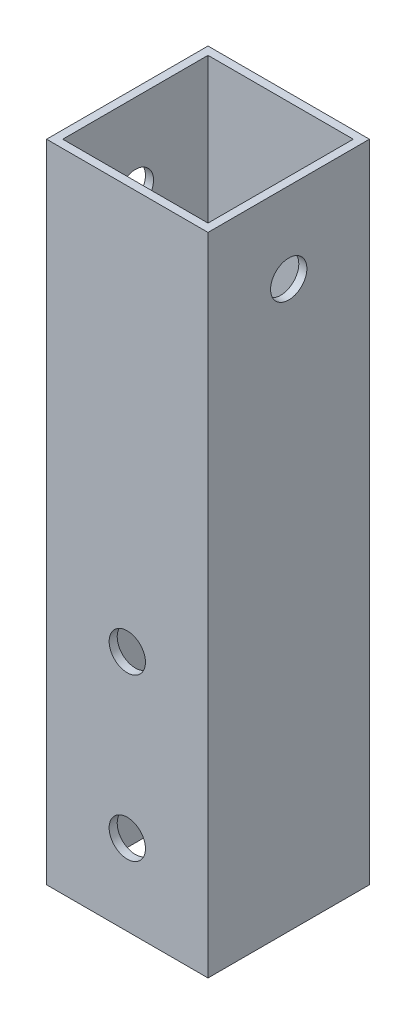
ISO-10303-21;
HEADER;
FILE_DESCRIPTION(('STEP AP214'),'2;1');
FILE_NAME('part.step','',(''),(''),'','','');
FILE_SCHEMA(('AUTOMOTIVE_DESIGN { 1 0 10303 214 1 1 1 1 }'));
ENDSEC;
DATA;
#1=APPLICATION_CONTEXT('core data for automotive mechanical design processes');
#2=APPLICATION_PROTOCOL_DEFINITION('international standard','automotive_design',2000,#1);
#3=PRODUCT_CONTEXT('',#1,'mechanical');
#4=PRODUCT('Part','Part','',(#3));
#5=PRODUCT_RELATED_PRODUCT_CATEGORY('part','',(#4));
#6=PRODUCT_DEFINITION_FORMATION('','',#4);
#7=PRODUCT_DEFINITION_CONTEXT('part definition',#1,'design');
#8=PRODUCT_DEFINITION('design','',#6,#7);
#9=PRODUCT_DEFINITION_SHAPE('','',#8);
#10=(LENGTH_UNIT() NAMED_UNIT(*) SI_UNIT(.MILLI.,.METRE.));
#11=(NAMED_UNIT(*) PLANE_ANGLE_UNIT() SI_UNIT($,.RADIAN.));
#12=(NAMED_UNIT(*) SI_UNIT($,.STERADIAN.) SOLID_ANGLE_UNIT());
#13=UNCERTAINTY_MEASURE_WITH_UNIT(LENGTH_MEASURE(1.E-05),#10,'distance_accuracy_value','');
#14=(GEOMETRIC_REPRESENTATION_CONTEXT(3) GLOBAL_UNCERTAINTY_ASSIGNED_CONTEXT((#13)) GLOBAL_UNIT_ASSIGNED_CONTEXT((#10,
#11,#12)) REPRESENTATION_CONTEXT('',''));
#15=CARTESIAN_POINT('',(0.,0.,0.));
#16=DIRECTION('',(0.,0.,1.));
#17=DIRECTION('',(1.,0.,0.));
#18=AXIS2_PLACEMENT_3D('',#15,#16,#17);
#19=CARTESIAN_POINT('',(0.,80.,0.));
#20=DIRECTION('',(0.,-1.,0.));
#21=DIRECTION('',(0.,0.,-1.));
#22=AXIS2_PLACEMENT_3D('',#19,#20,#21);
#23=PLANE('',#22);
#24=DIRECTION('',(0.,0.,-1.));
#25=VECTOR('',#24,1.);
#26=CARTESIAN_POINT('',(10.,80.,10.));
#27=LINE('',#26,#25);
#28=CARTESIAN_POINT('',(10.,80.,10.));
#29=VERTEX_POINT('',#28);
#30=CARTESIAN_POINT('',(10.,80.,-10.));
#31=VERTEX_POINT('',#30);
#32=EDGE_CURVE('E142',#29,#31,#27,.T.);
#33=ORIENTED_EDGE('',*,*,#32,.T.);
#34=DIRECTION('',(-1.,0.,0.));
#35=VECTOR('',#34,1.);
#36=CARTESIAN_POINT('',(-10.,80.,-10.));
#37=LINE('',#36,#35);
#38=CARTESIAN_POINT('',(-10.,80.,-10.));
#39=VERTEX_POINT('',#38);
#40=EDGE_CURVE('E145',#31,#39,#37,.T.);
#41=ORIENTED_EDGE('',*,*,#40,.T.);
#42=DIRECTION('',(0.,0.,1.));
#43=VECTOR('',#42,1.);
#44=CARTESIAN_POINT('',(-10.,80.,10.));
#45=LINE('',#44,#43);
#46=CARTESIAN_POINT('',(-10.,80.,10.));
#47=VERTEX_POINT('',#46);
#48=EDGE_CURVE('E148',#39,#47,#45,.T.);
#49=ORIENTED_EDGE('',*,*,#48,.T.);
#50=DIRECTION('',(1.,0.,0.));
#51=VECTOR('',#50,1.);
#52=CARTESIAN_POINT('',(-10.,80.,10.));
#53=LINE('',#52,#51);
#54=EDGE_CURVE('E150',#47,#29,#53,.T.);
#55=ORIENTED_EDGE('',*,*,#54,.T.);
#56=EDGE_LOOP('',(#33,#41,#49,#55));
#57=FACE_BOUND('',#56,.T.);
#58=DIRECTION('',(1.,0.,0.));
#59=VECTOR('',#58,1.);
#60=CARTESIAN_POINT('',(-9.,80.,9.));
#61=LINE('',#60,#59);
#62=CARTESIAN_POINT('',(-9.,80.,9.));
#63=VERTEX_POINT('',#62);
#64=CARTESIAN_POINT('',(9.,80.,9.));
#65=VERTEX_POINT('',#64);
#66=EDGE_CURVE('E104',#63,#65,#61,.T.);
#67=ORIENTED_EDGE('',*,*,#66,.F.);
#68=DIRECTION('',(0.,0.,1.));
#69=VECTOR('',#68,1.);
#70=CARTESIAN_POINT('',(-9.,80.,9.));
#71=LINE('',#70,#69);
#72=CARTESIAN_POINT('',(-9.,80.,-9.));
#73=VERTEX_POINT('',#72);
#74=EDGE_CURVE('E126',#73,#63,#71,.T.);
#75=ORIENTED_EDGE('',*,*,#74,.F.);
#76=DIRECTION('',(-1.,0.,0.));
#77=VECTOR('',#76,1.);
#78=CARTESIAN_POINT('',(-9.,80.,-9.));
#79=LINE('',#78,#77);
#80=CARTESIAN_POINT('',(9.,80.,-9.));
#81=VERTEX_POINT('',#80);
#82=EDGE_CURVE('E124',#81,#73,#79,.T.);
#83=ORIENTED_EDGE('',*,*,#82,.F.);
#84=DIRECTION('',(0.,0.,-1.));
#85=VECTOR('',#84,1.);
#86=CARTESIAN_POINT('',(9.,80.,9.));
#87=LINE('',#86,#85);
#88=EDGE_CURVE('E112',#65,#81,#87,.T.);
#89=ORIENTED_EDGE('',*,*,#88,.F.);
#90=EDGE_LOOP('',(#67,#75,#83,#89));
#91=FACE_BOUND('',#90,.T.);
#92=ADVANCED_FACE('F37',(#57,#91),#23,.F.);
#93=CARTESIAN_POINT('',(0.,0.,0.));
#94=DIRECTION('',(0.,-1.,0.));
#95=DIRECTION('',(0.,0.,-1.));
#96=AXIS2_PLACEMENT_3D('',#93,#94,#95);
#97=PLANE('',#96);
#98=DIRECTION('',(0.,0.,-1.));
#99=VECTOR('',#98,1.);
#100=CARTESIAN_POINT('',(10.,0.,10.));
#101=LINE('',#100,#99);
#102=CARTESIAN_POINT('',(10.,0.,10.));
#103=VERTEX_POINT('',#102);
#104=CARTESIAN_POINT('',(10.,0.,-10.));
#105=VERTEX_POINT('',#104);
#106=EDGE_CURVE('E120',#103,#105,#101,.T.);
#107=ORIENTED_EDGE('',*,*,#106,.F.);
#108=DIRECTION('',(1.,0.,0.));
#109=VECTOR('',#108,1.);
#110=CARTESIAN_POINT('',(-10.,0.,10.));
#111=LINE('',#110,#109);
#112=CARTESIAN_POINT('',(-10.,0.,10.));
#113=VERTEX_POINT('',#112);
#114=EDGE_CURVE('E146',#113,#103,#111,.T.);
#115=ORIENTED_EDGE('',*,*,#114,.F.);
#116=DIRECTION('',(0.,0.,1.));
#117=VECTOR('',#116,1.);
#118=CARTESIAN_POINT('',(-10.,0.,10.));
#119=LINE('',#118,#117);
#120=CARTESIAN_POINT('',(-10.,0.,-10.));
#121=VERTEX_POINT('',#120);
#122=EDGE_CURVE('E157',#121,#113,#119,.T.);
#123=ORIENTED_EDGE('',*,*,#122,.F.);
#124=DIRECTION('',(-1.,0.,0.));
#125=VECTOR('',#124,1.);
#126=CARTESIAN_POINT('',(-10.,0.,-10.));
#127=LINE('',#126,#125);
#128=EDGE_CURVE('E155',#105,#121,#127,.T.);
#129=ORIENTED_EDGE('',*,*,#128,.F.);
#130=EDGE_LOOP('',(#107,#115,#123,#129));
#131=FACE_BOUND('',#130,.T.);
#132=DIRECTION('',(0.,0.,1.));
#133=VECTOR('',#132,1.);
#134=CARTESIAN_POINT('',(-9.,0.,9.));
#135=LINE('',#134,#133);
#136=CARTESIAN_POINT('',(-9.,0.,-9.));
#137=VERTEX_POINT('',#136);
#138=CARTESIAN_POINT('',(-9.,0.,9.));
#139=VERTEX_POINT('',#138);
#140=EDGE_CURVE('E113',#137,#139,#135,.T.);
#141=ORIENTED_EDGE('',*,*,#140,.T.);
#142=DIRECTION('',(1.,0.,0.));
#143=VECTOR('',#142,1.);
#144=CARTESIAN_POINT('',(-9.,0.,9.));
#145=LINE('',#144,#143);
#146=CARTESIAN_POINT('',(9.,0.,9.));
#147=VERTEX_POINT('',#146);
#148=EDGE_CURVE('E62',#139,#147,#145,.T.);
#149=ORIENTED_EDGE('',*,*,#148,.T.);
#150=DIRECTION('',(0.,0.,-1.));
#151=VECTOR('',#150,1.);
#152=CARTESIAN_POINT('',(9.,0.,9.));
#153=LINE('',#152,#151);
#154=CARTESIAN_POINT('',(9.,0.,-9.));
#155=VERTEX_POINT('',#154);
#156=EDGE_CURVE('E119',#147,#155,#153,.T.);
#157=ORIENTED_EDGE('',*,*,#156,.T.);
#158=DIRECTION('',(-1.,0.,0.));
#159=VECTOR('',#158,1.);
#160=CARTESIAN_POINT('',(-9.,0.,-9.));
#161=LINE('',#160,#159);
#162=EDGE_CURVE('E134',#155,#137,#161,.T.);
#163=ORIENTED_EDGE('',*,*,#162,.T.);
#164=EDGE_LOOP('',(#141,#149,#157,#163));
#165=FACE_BOUND('',#164,.T.);
#166=ADVANCED_FACE('F215',(#131,#165),#97,.T.);
#167=CARTESIAN_POINT('',(10.,80.,10.));
#168=DIRECTION('',(-1.,0.,0.));
#169=DIRECTION('',(0.,0.,1.));
#170=AXIS2_PLACEMENT_3D('',#167,#168,#169);
#171=PLANE('',#170);
#172=CARTESIAN_POINT('',(10.,70.,0.));
#173=DIRECTION('',(1.,0.,0.));
#174=DIRECTION('',(0.,0.,-1.));
#175=AXIS2_PLACEMENT_3D('',#172,#173,#174);
#176=CIRCLE('',#175,2.25);
#177=CARTESIAN_POINT('',(10.,70.,-2.25));
#178=VERTEX_POINT('',#177);
#179=EDGE_CURVE('E195',#178,#178,#176,.T.);
#180=ORIENTED_EDGE('',*,*,#179,.F.);
#181=EDGE_LOOP('',(#180));
#182=FACE_BOUND('',#181,.T.);
#183=ORIENTED_EDGE('',*,*,#106,.T.);
#184=DIRECTION('',(0.,-1.,0.));
#185=VECTOR('',#184,1.);
#186=CARTESIAN_POINT('',(10.,80.,-10.));
#187=LINE('',#186,#185);
#188=EDGE_CURVE('E11',#31,#105,#187,.T.);
#189=ORIENTED_EDGE('',*,*,#188,.F.);
#190=ORIENTED_EDGE('',*,*,#32,.F.);
#191=DIRECTION('',(0.,-1.,0.));
#192=VECTOR('',#191,1.);
#193=CARTESIAN_POINT('',(10.,80.,10.));
#194=LINE('',#193,#192);
#195=EDGE_CURVE('E152',#29,#103,#194,.T.);
#196=ORIENTED_EDGE('',*,*,#195,.T.);
#197=EDGE_LOOP('',(#183,#189,#190,#196));
#198=FACE_BOUND('',#197,.T.);
#199=ADVANCED_FACE('F39',(#182,#198),#171,.F.);
#200=CARTESIAN_POINT('',(-10.,80.,-10.));
#201=DIRECTION('',(0.,0.,1.));
#202=DIRECTION('',(1.,0.,0.));
#203=AXIS2_PLACEMENT_3D('',#200,#201,#202);
#204=PLANE('',#203);
#205=CARTESIAN_POINT('',(0.,10.,-10.));
#206=DIRECTION('',(0.,0.,1.));
#207=DIRECTION('',(1.,0.,0.));
#208=AXIS2_PLACEMENT_3D('',#205,#206,#207);
#209=CIRCLE('',#208,2.25);
#210=CARTESIAN_POINT('',(2.25,10.,-10.));
#211=VERTEX_POINT('',#210);
#212=EDGE_CURVE('E170',#211,#211,#209,.T.);
#213=ORIENTED_EDGE('',*,*,#212,.T.);
#214=EDGE_LOOP('',(#213));
#215=FACE_BOUND('',#214,.T.);
#216=CARTESIAN_POINT('',(0.,30.,-10.));
#217=DIRECTION('',(0.,0.,1.));
#218=DIRECTION('',(1.,0.,0.));
#219=AXIS2_PLACEMENT_3D('',#216,#217,#218);
#220=CIRCLE('',#219,2.25);
#221=CARTESIAN_POINT('',(2.25,30.,-10.));
#222=VERTEX_POINT('',#221);
#223=EDGE_CURVE('E181',#222,#222,#220,.T.);
#224=ORIENTED_EDGE('',*,*,#223,.T.);
#225=EDGE_LOOP('',(#224));
#226=FACE_BOUND('',#225,.T.);
#227=ORIENTED_EDGE('',*,*,#128,.T.);
#228=DIRECTION('',(0.,-1.,0.));
#229=VECTOR('',#228,1.);
#230=CARTESIAN_POINT('',(-10.,80.,-10.));
#231=LINE('',#230,#229);
#232=EDGE_CURVE('E46',#39,#121,#231,.T.);
#233=ORIENTED_EDGE('',*,*,#232,.F.);
#234=ORIENTED_EDGE('',*,*,#40,.F.);
#235=ORIENTED_EDGE('',*,*,#188,.T.);
#236=EDGE_LOOP('',(#227,#233,#234,#235));
#237=FACE_BOUND('',#236,.T.);
#238=ADVANCED_FACE('F242',(#215,#226,#237),#204,.F.);
#239=CARTESIAN_POINT('',(-10.,80.,10.));
#240=DIRECTION('',(1.,0.,0.));
#241=DIRECTION('',(0.,0.,-1.));
#242=AXIS2_PLACEMENT_3D('',#239,#240,#241);
#243=PLANE('',#242);
#244=CARTESIAN_POINT('',(-10.,70.,0.));
#245=DIRECTION('',(1.,0.,0.));
#246=DIRECTION('',(0.,0.,-1.));
#247=AXIS2_PLACEMENT_3D('',#244,#245,#246);
#248=CIRCLE('',#247,2.25);
#249=CARTESIAN_POINT('',(-10.,70.,-2.25));
#250=VERTEX_POINT('',#249);
#251=EDGE_CURVE('E198',#250,#250,#248,.T.);
#252=ORIENTED_EDGE('',*,*,#251,.T.);
#253=EDGE_LOOP('',(#252));
#254=FACE_BOUND('',#253,.T.);
#255=ORIENTED_EDGE('',*,*,#122,.T.);
#256=DIRECTION('',(0.,-1.,0.));
#257=VECTOR('',#256,1.);
#258=CARTESIAN_POINT('',(-10.,80.,10.));
#259=LINE('',#258,#257);
#260=EDGE_CURVE('E162',#47,#113,#259,.T.);
#261=ORIENTED_EDGE('',*,*,#260,.F.);
#262=ORIENTED_EDGE('',*,*,#48,.F.);
#263=ORIENTED_EDGE('',*,*,#232,.T.);
#264=EDGE_LOOP('',(#255,#261,#262,#263));
#265=FACE_BOUND('',#264,.T.);
#266=ADVANCED_FACE('F239',(#254,#265),#243,.F.);
#267=CARTESIAN_POINT('',(-10.,80.,10.));
#268=DIRECTION('',(0.,0.,-1.));
#269=DIRECTION('',(-1.,0.,0.));
#270=AXIS2_PLACEMENT_3D('',#267,#268,#269);
#271=PLANE('',#270);
#272=CARTESIAN_POINT('',(0.,10.,10.));
#273=DIRECTION('',(0.,0.,1.));
#274=DIRECTION('',(1.,0.,0.));
#275=AXIS2_PLACEMENT_3D('',#272,#273,#274);
#276=CIRCLE('',#275,2.25);
#277=CARTESIAN_POINT('',(2.25,10.,10.));
#278=VERTEX_POINT('',#277);
#279=EDGE_CURVE('E188',#278,#278,#276,.T.);
#280=ORIENTED_EDGE('',*,*,#279,.F.);
#281=EDGE_LOOP('',(#280));
#282=FACE_BOUND('',#281,.T.);
#283=CARTESIAN_POINT('',(0.,30.,10.));
#284=DIRECTION('',(0.,0.,1.));
#285=DIRECTION('',(1.,0.,0.));
#286=AXIS2_PLACEMENT_3D('',#283,#284,#285);
#287=CIRCLE('',#286,2.25);
#288=CARTESIAN_POINT('',(2.25,30.,10.));
#289=VERTEX_POINT('',#288);
#290=EDGE_CURVE('E184',#289,#289,#287,.T.);
#291=ORIENTED_EDGE('',*,*,#290,.F.);
#292=EDGE_LOOP('',(#291));
#293=FACE_BOUND('',#292,.T.);
#294=ORIENTED_EDGE('',*,*,#114,.T.);
#295=ORIENTED_EDGE('',*,*,#195,.F.);
#296=ORIENTED_EDGE('',*,*,#54,.F.);
#297=ORIENTED_EDGE('',*,*,#260,.T.);
#298=EDGE_LOOP('',(#294,#295,#296,#297));
#299=FACE_BOUND('',#298,.T.);
#300=ADVANCED_FACE('F236',(#282,#293,#299),#271,.F.);
#301=CARTESIAN_POINT('',(-9.,80.,9.));
#302=DIRECTION('',(0.,0.,-1.));
#303=DIRECTION('',(-1.,0.,0.));
#304=AXIS2_PLACEMENT_3D('',#301,#302,#303);
#305=PLANE('',#304);
#306=CARTESIAN_POINT('',(0.,10.,9.));
#307=DIRECTION('',(0.,0.,-1.));
#308=DIRECTION('',(-1.,0.,0.));
#309=AXIS2_PLACEMENT_3D('',#306,#307,#308);
#310=CIRCLE('',#309,2.25);
#311=CARTESIAN_POINT('',(-2.25,10.,9.));
#312=VERTEX_POINT('',#311);
#313=EDGE_CURVE('E132',#312,#312,#310,.T.);
#314=ORIENTED_EDGE('',*,*,#313,.F.);
#315=EDGE_LOOP('',(#314));
#316=FACE_BOUND('',#315,.T.);
#317=CARTESIAN_POINT('',(0.,30.,9.));
#318=DIRECTION('',(0.,0.,-1.));
#319=DIRECTION('',(-1.,0.,0.));
#320=AXIS2_PLACEMENT_3D('',#317,#318,#319);
#321=CIRCLE('',#320,2.25);
#322=CARTESIAN_POINT('',(-2.25,30.,9.));
#323=VERTEX_POINT('',#322);
#324=EDGE_CURVE('E169',#323,#323,#321,.T.);
#325=ORIENTED_EDGE('',*,*,#324,.F.);
#326=EDGE_LOOP('',(#325));
#327=FACE_BOUND('',#326,.T.);
#328=ORIENTED_EDGE('',*,*,#148,.F.);
#329=DIRECTION('',(0.,-1.,0.));
#330=VECTOR('',#329,1.);
#331=CARTESIAN_POINT('',(-9.,80.,9.));
#332=LINE('',#331,#330);
#333=EDGE_CURVE('E108',#63,#139,#332,.T.);
#334=ORIENTED_EDGE('',*,*,#333,.F.);
#335=ORIENTED_EDGE('',*,*,#66,.T.);
#336=DIRECTION('',(0.,-1.,0.));
#337=VECTOR('',#336,1.);
#338=CARTESIAN_POINT('',(9.,80.,9.));
#339=LINE('',#338,#337);
#340=EDGE_CURVE('E107',#65,#147,#339,.T.);
#341=ORIENTED_EDGE('',*,*,#340,.T.);
#342=EDGE_LOOP('',(#328,#334,#335,#341));
#343=FACE_BOUND('',#342,.T.);
#344=ADVANCED_FACE('F106',(#316,#327,#343),#305,.T.);
#345=CARTESIAN_POINT('',(9.,80.,9.));
#346=DIRECTION('',(-1.,0.,0.));
#347=DIRECTION('',(0.,0.,1.));
#348=AXIS2_PLACEMENT_3D('',#345,#346,#347);
#349=PLANE('',#348);
#350=CARTESIAN_POINT('',(9.,70.,0.));
#351=DIRECTION('',(-1.,0.,0.));
#352=DIRECTION('',(0.,0.,1.));
#353=AXIS2_PLACEMENT_3D('',#350,#351,#352);
#354=CIRCLE('',#353,2.25);
#355=CARTESIAN_POINT('',(9.,70.,2.25));
#356=VERTEX_POINT('',#355);
#357=EDGE_CURVE('E185',#356,#356,#354,.T.);
#358=ORIENTED_EDGE('',*,*,#357,.F.);
#359=EDGE_LOOP('',(#358));
#360=FACE_BOUND('',#359,.T.);
#361=ORIENTED_EDGE('',*,*,#156,.F.);
#362=ORIENTED_EDGE('',*,*,#340,.F.);
#363=ORIENTED_EDGE('',*,*,#88,.T.);
#364=DIRECTION('',(0.,-1.,0.));
#365=VECTOR('',#364,1.);
#366=CARTESIAN_POINT('',(9.,80.,-9.));
#367=LINE('',#366,#365);
#368=EDGE_CURVE('E121',#81,#155,#367,.T.);
#369=ORIENTED_EDGE('',*,*,#368,.T.);
#370=EDGE_LOOP('',(#361,#362,#363,#369));
#371=FACE_BOUND('',#370,.T.);
#372=ADVANCED_FACE('F116',(#360,#371),#349,.T.);
#373=CARTESIAN_POINT('',(-9.,80.,-9.));
#374=DIRECTION('',(0.,0.,1.));
#375=DIRECTION('',(1.,0.,0.));
#376=AXIS2_PLACEMENT_3D('',#373,#374,#375);
#377=PLANE('',#376);
#378=CARTESIAN_POINT('',(0.,10.,-9.));
#379=DIRECTION('',(0.,0.,1.));
#380=DIRECTION('',(1.,0.,0.));
#381=AXIS2_PLACEMENT_3D('',#378,#379,#380);
#382=CIRCLE('',#381,2.25);
#383=CARTESIAN_POINT('',(2.25,10.,-9.));
#384=VERTEX_POINT('',#383);
#385=EDGE_CURVE('E171',#384,#384,#382,.T.);
#386=ORIENTED_EDGE('',*,*,#385,.F.);
#387=EDGE_LOOP('',(#386));
#388=FACE_BOUND('',#387,.T.);
#389=CARTESIAN_POINT('',(0.,30.,-9.));
#390=DIRECTION('',(0.,0.,1.));
#391=DIRECTION('',(1.,0.,0.));
#392=AXIS2_PLACEMENT_3D('',#389,#390,#391);
#393=CIRCLE('',#392,2.25);
#394=CARTESIAN_POINT('',(2.25,30.,-9.));
#395=VERTEX_POINT('',#394);
#396=EDGE_CURVE('E167',#395,#395,#393,.T.);
#397=ORIENTED_EDGE('',*,*,#396,.F.);
#398=EDGE_LOOP('',(#397));
#399=FACE_BOUND('',#398,.T.);
#400=ORIENTED_EDGE('',*,*,#162,.F.);
#401=ORIENTED_EDGE('',*,*,#368,.F.);
#402=ORIENTED_EDGE('',*,*,#82,.T.);
#403=DIRECTION('',(0.,-1.,0.));
#404=VECTOR('',#403,1.);
#405=CARTESIAN_POINT('',(-9.,80.,-9.));
#406=LINE('',#405,#404);
#407=EDGE_CURVE('E54',#73,#137,#406,.T.);
#408=ORIENTED_EDGE('',*,*,#407,.T.);
#409=EDGE_LOOP('',(#400,#401,#402,#408));
#410=FACE_BOUND('',#409,.T.);
#411=ADVANCED_FACE('F211',(#388,#399,#410),#377,.T.);
#412=CARTESIAN_POINT('',(-9.,80.,9.));
#413=DIRECTION('',(1.,0.,0.));
#414=DIRECTION('',(0.,0.,-1.));
#415=AXIS2_PLACEMENT_3D('',#412,#413,#414);
#416=PLANE('',#415);
#417=CARTESIAN_POINT('',(-9.,70.,0.));
#418=DIRECTION('',(1.,0.,0.));
#419=DIRECTION('',(0.,0.,-1.));
#420=AXIS2_PLACEMENT_3D('',#417,#418,#419);
#421=CIRCLE('',#420,2.25);
#422=CARTESIAN_POINT('',(-9.,70.,-2.25));
#423=VERTEX_POINT('',#422);
#424=EDGE_CURVE('E41',#423,#423,#421,.T.);
#425=ORIENTED_EDGE('',*,*,#424,.F.);
#426=EDGE_LOOP('',(#425));
#427=FACE_BOUND('',#426,.T.);
#428=ORIENTED_EDGE('',*,*,#140,.F.);
#429=ORIENTED_EDGE('',*,*,#407,.F.);
#430=ORIENTED_EDGE('',*,*,#74,.T.);
#431=ORIENTED_EDGE('',*,*,#333,.T.);
#432=EDGE_LOOP('',(#428,#429,#430,#431));
#433=FACE_BOUND('',#432,.T.);
#434=ADVANCED_FACE('F208',(#427,#433),#416,.T.);
#435=CARTESIAN_POINT('',(0.,30.,-10.));
#436=DIRECTION('',(0.,0.,1.));
#437=DIRECTION('',(1.,0.,0.));
#438=AXIS2_PLACEMENT_3D('',#435,#436,#437);
#439=CYLINDRICAL_SURFACE('',#438,2.25);
#440=ORIENTED_EDGE('',*,*,#396,.T.);
#441=EDGE_LOOP('',(#440));
#442=FACE_BOUND('',#441,.T.);
#443=ORIENTED_EDGE('',*,*,#223,.F.);
#444=EDGE_LOOP('',(#443));
#445=FACE_BOUND('',#444,.T.);
#446=ADVANCED_FACE('F210',(#442,#445),#439,.F.);
#447=CARTESIAN_POINT('',(0.,10.,-10.));
#448=DIRECTION('',(0.,0.,1.));
#449=DIRECTION('',(1.,0.,0.));
#450=AXIS2_PLACEMENT_3D('',#447,#448,#449);
#451=CYLINDRICAL_SURFACE('',#450,2.25);
#452=ORIENTED_EDGE('',*,*,#385,.T.);
#453=EDGE_LOOP('',(#452));
#454=FACE_BOUND('',#453,.T.);
#455=ORIENTED_EDGE('',*,*,#212,.F.);
#456=EDGE_LOOP('',(#455));
#457=FACE_BOUND('',#456,.T.);
#458=ADVANCED_FACE('F268',(#454,#457),#451,.F.);
#459=ORIENTED_EDGE('',*,*,#324,.T.);
#460=EDGE_LOOP('',(#459));
#461=FACE_BOUND('',#460,.T.);
#462=ORIENTED_EDGE('',*,*,#290,.T.);
#463=EDGE_LOOP('',(#462));
#464=FACE_BOUND('',#463,.T.);
#465=ADVANCED_FACE('F271',(#461,#464),#439,.F.);
#466=ORIENTED_EDGE('',*,*,#313,.T.);
#467=EDGE_LOOP('',(#466));
#468=FACE_BOUND('',#467,.T.);
#469=ORIENTED_EDGE('',*,*,#279,.T.);
#470=EDGE_LOOP('',(#469));
#471=FACE_BOUND('',#470,.T.);
#472=ADVANCED_FACE('F276',(#468,#471),#451,.F.);
#473=CARTESIAN_POINT('',(-10.,70.,0.));
#474=DIRECTION('',(1.,0.,0.));
#475=DIRECTION('',(0.,0.,-1.));
#476=AXIS2_PLACEMENT_3D('',#473,#474,#475);
#477=CYLINDRICAL_SURFACE('',#476,2.25);
#478=ORIENTED_EDGE('',*,*,#424,.T.);
#479=EDGE_LOOP('',(#478));
#480=FACE_BOUND('',#479,.T.);
#481=ORIENTED_EDGE('',*,*,#251,.F.);
#482=EDGE_LOOP('',(#481));
#483=FACE_BOUND('',#482,.T.);
#484=ADVANCED_FACE('F205',(#480,#483),#477,.F.);
#485=ORIENTED_EDGE('',*,*,#357,.T.);
#486=EDGE_LOOP('',(#485));
#487=FACE_BOUND('',#486,.T.);
#488=ORIENTED_EDGE('',*,*,#179,.T.);
#489=EDGE_LOOP('',(#488));
#490=FACE_BOUND('',#489,.T.);
#491=ADVANCED_FACE('F288',(#487,#490),#477,.F.);
#492=CLOSED_SHELL('',(#92,#166,#199,#238,#266,#300,#344,#372,#411,#434,#446,#458,#465,#472,#484,#491));
#493=MANIFOLD_SOLID_BREP('B2',#492);
#494=ADVANCED_BREP_SHAPE_REPRESENTATION('',(#18,#493),#14);
#495=SHAPE_DEFINITION_REPRESENTATION(#9,#494);
ENDSEC;
END-ISO-10303-21;
